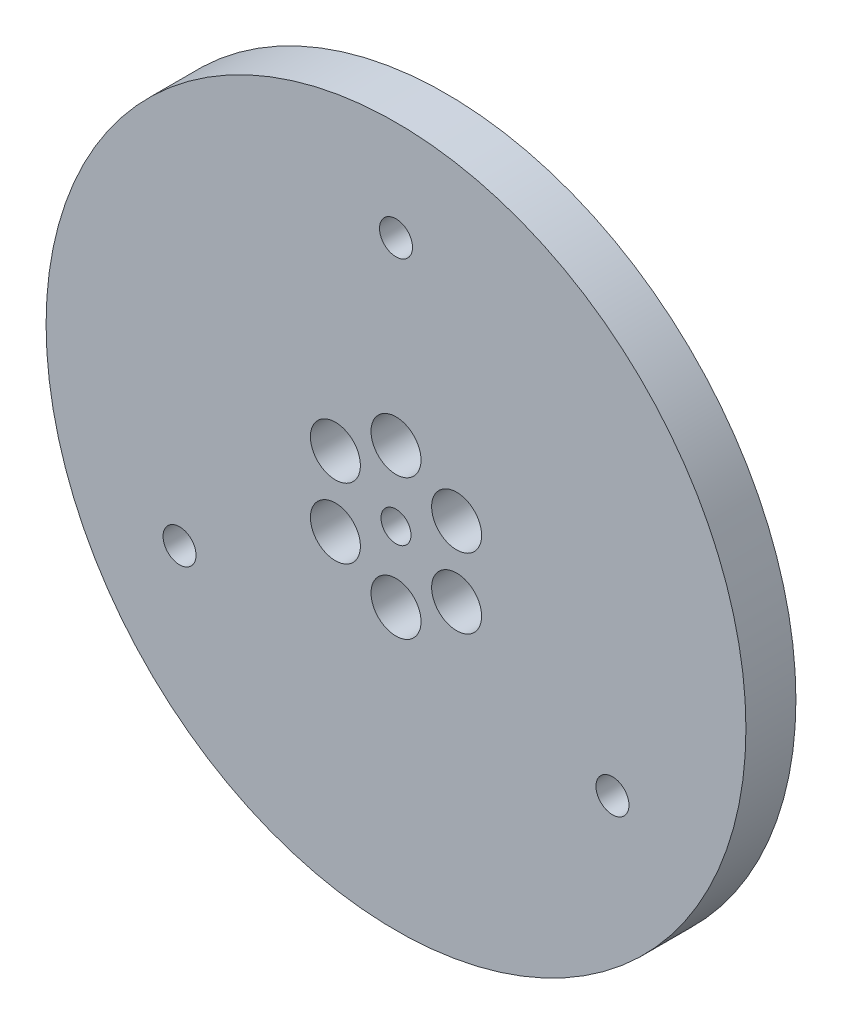
ISO-10303-21;
HEADER;
FILE_DESCRIPTION(('STEP AP214'),'2;1');
FILE_NAME('part.step','',(''),(''),'','','');
FILE_SCHEMA(('AUTOMOTIVE_DESIGN { 1 0 10303 214 1 1 1 1 }'));
ENDSEC;
DATA;
#1=APPLICATION_CONTEXT('core data for automotive mechanical design processes');
#2=APPLICATION_PROTOCOL_DEFINITION('international standard','automotive_design',2000,#1);
#3=PRODUCT_CONTEXT('',#1,'mechanical');
#4=PRODUCT('Part','Part','',(#3));
#5=PRODUCT_RELATED_PRODUCT_CATEGORY('part','',(#4));
#6=PRODUCT_DEFINITION_FORMATION('','',#4);
#7=PRODUCT_DEFINITION_CONTEXT('part definition',#1,'design');
#8=PRODUCT_DEFINITION('design','',#6,#7);
#9=PRODUCT_DEFINITION_SHAPE('','',#8);
#10=(LENGTH_UNIT() NAMED_UNIT(*) SI_UNIT(.MILLI.,.METRE.));
#11=(NAMED_UNIT(*) PLANE_ANGLE_UNIT() SI_UNIT($,.RADIAN.));
#12=(NAMED_UNIT(*) SI_UNIT($,.STERADIAN.) SOLID_ANGLE_UNIT());
#13=UNCERTAINTY_MEASURE_WITH_UNIT(LENGTH_MEASURE(1.E-05),#10,'distance_accuracy_value','');
#14=(GEOMETRIC_REPRESENTATION_CONTEXT(3) GLOBAL_UNCERTAINTY_ASSIGNED_CONTEXT((#13)) GLOBAL_UNIT_ASSIGNED_CONTEXT((#10,
#11,#12)) REPRESENTATION_CONTEXT('',''));
#15=CARTESIAN_POINT('',(0.,0.,0.));
#16=DIRECTION('',(0.,0.,1.));
#17=DIRECTION('',(1.,0.,0.));
#18=AXIS2_PLACEMENT_3D('',#15,#16,#17);
#19=CARTESIAN_POINT('',(0.,0.,5.));
#20=DIRECTION('',(0.,0.,1.));
#21=DIRECTION('',(1.,0.,0.));
#22=AXIS2_PLACEMENT_3D('',#19,#20,#21);
#23=PLANE('',#22);
#24=CARTESIAN_POINT('',(-6.06217782649107,-3.5,5.));
#25=DIRECTION('',(0.,0.,1.));
#26=DIRECTION('',(1.,0.,0.));
#27=AXIS2_PLACEMENT_3D('',#24,#25,#26);
#28=CIRCLE('',#27,2.5);
#29=CARTESIAN_POINT('',(-3.56217782649107,-3.5,5.));
#30=VERTEX_POINT('',#29);
#31=EDGE_CURVE('E104',#30,#30,#28,.T.);
#32=ORIENTED_EDGE('',*,*,#31,.F.);
#33=EDGE_LOOP('',(#32));
#34=FACE_BOUND('',#33,.T.);
#35=CARTESIAN_POINT('',(6.06217782649107,-3.5,5.));
#36=DIRECTION('',(0.,0.,1.));
#37=DIRECTION('',(1.,0.,0.));
#38=AXIS2_PLACEMENT_3D('',#35,#36,#37);
#39=CIRCLE('',#38,2.5);
#40=CARTESIAN_POINT('',(8.56217782649107,-3.5,5.));
#41=VERTEX_POINT('',#40);
#42=EDGE_CURVE('E108',#41,#41,#39,.T.);
#43=ORIENTED_EDGE('',*,*,#42,.F.);
#44=EDGE_LOOP('',(#43));
#45=FACE_BOUND('',#44,.T.);
#46=CARTESIAN_POINT('',(0.,7.,5.));
#47=DIRECTION('',(0.,0.,1.));
#48=DIRECTION('',(1.,0.,0.));
#49=AXIS2_PLACEMENT_3D('',#46,#47,#48);
#50=CIRCLE('',#49,2.5);
#51=CARTESIAN_POINT('',(2.5,7.,5.));
#52=VERTEX_POINT('',#51);
#53=EDGE_CURVE('E112',#52,#52,#50,.T.);
#54=ORIENTED_EDGE('',*,*,#53,.F.);
#55=EDGE_LOOP('',(#54));
#56=FACE_BOUND('',#55,.T.);
#57=CARTESIAN_POINT('',(21.650635094611,-12.5,5.));
#58=DIRECTION('',(0.,0.,1.));
#59=DIRECTION('',(1.,0.,0.));
#60=AXIS2_PLACEMENT_3D('',#57,#58,#59);
#61=CIRCLE('',#60,1.65000000000014);
#62=CARTESIAN_POINT('',(23.3006350946111,-12.5,5.));
#63=VERTEX_POINT('',#62);
#64=EDGE_CURVE('E70',#63,#63,#61,.T.);
#65=ORIENTED_EDGE('',*,*,#64,.F.);
#66=EDGE_LOOP('',(#65));
#67=FACE_BOUND('',#66,.T.);
#68=CARTESIAN_POINT('',(0.,0.,5.));
#69=DIRECTION('',(0.,0.,1.));
#70=DIRECTION('',(1.,0.,0.));
#71=AXIS2_PLACEMENT_3D('',#68,#69,#70);
#72=CIRCLE('',#71,1.5);
#73=CARTESIAN_POINT('',(1.5,0.,5.));
#74=VERTEX_POINT('',#73);
#75=EDGE_CURVE('E48',#74,#74,#72,.T.);
#76=ORIENTED_EDGE('',*,*,#75,.F.);
#77=EDGE_LOOP('',(#76));
#78=FACE_BOUND('',#77,.T.);
#79=CARTESIAN_POINT('',(0.,0.,5.));
#80=DIRECTION('',(0.,0.,1.));
#81=DIRECTION('',(1.,0.,0.));
#82=AXIS2_PLACEMENT_3D('',#79,#80,#81);
#83=CIRCLE('',#82,35.);
#84=CARTESIAN_POINT('',(35.,0.,5.));
#85=VERTEX_POINT('',#84);
#86=EDGE_CURVE('E11',#85,#85,#83,.T.);
#87=ORIENTED_EDGE('',*,*,#86,.T.);
#88=EDGE_LOOP('',(#87));
#89=FACE_BOUND('',#88,.T.);
#90=CARTESIAN_POINT('',(0.,25.,5.));
#91=DIRECTION('',(0.,0.,1.));
#92=DIRECTION('',(1.,0.,0.));
#93=AXIS2_PLACEMENT_3D('',#90,#91,#92);
#94=CIRCLE('',#93,1.65);
#95=CARTESIAN_POINT('',(1.65,25.,5.));
#96=VERTEX_POINT('',#95);
#97=EDGE_CURVE('E61',#96,#96,#94,.T.);
#98=ORIENTED_EDGE('',*,*,#97,.F.);
#99=EDGE_LOOP('',(#98));
#100=FACE_BOUND('',#99,.T.);
#101=CARTESIAN_POINT('',(-21.650635094611,-12.5,5.));
#102=DIRECTION('',(0.,0.,1.));
#103=DIRECTION('',(1.,0.,0.));
#104=AXIS2_PLACEMENT_3D('',#101,#102,#103);
#105=CIRCLE('',#104,1.65);
#106=CARTESIAN_POINT('',(-20.000635094611,-12.5,5.));
#107=VERTEX_POINT('',#106);
#108=EDGE_CURVE('E122',#107,#107,#105,.T.);
#109=ORIENTED_EDGE('',*,*,#108,.F.);
#110=EDGE_LOOP('',(#109));
#111=FACE_BOUND('',#110,.T.);
#112=CARTESIAN_POINT('',(6.06217782649107,3.5,5.));
#113=DIRECTION('',(0.,0.,1.));
#114=DIRECTION('',(1.,0.,0.));
#115=AXIS2_PLACEMENT_3D('',#112,#113,#114);
#116=CIRCLE('',#115,2.5);
#117=CARTESIAN_POINT('',(8.56217782649107,3.5,5.));
#118=VERTEX_POINT('',#117);
#119=EDGE_CURVE('E126',#118,#118,#116,.T.);
#120=ORIENTED_EDGE('',*,*,#119,.F.);
#121=EDGE_LOOP('',(#120));
#122=FACE_BOUND('',#121,.T.);
#123=CARTESIAN_POINT('',(0.,-7.,5.));
#124=DIRECTION('',(0.,0.,1.));
#125=DIRECTION('',(1.,0.,0.));
#126=AXIS2_PLACEMENT_3D('',#123,#124,#125);
#127=CIRCLE('',#126,2.5);
#128=CARTESIAN_POINT('',(2.5,-7.,5.));
#129=VERTEX_POINT('',#128);
#130=EDGE_CURVE('E130',#129,#129,#127,.T.);
#131=ORIENTED_EDGE('',*,*,#130,.F.);
#132=EDGE_LOOP('',(#131));
#133=FACE_BOUND('',#132,.T.);
#134=CARTESIAN_POINT('',(-6.06217782649107,3.49999999999999,5.));
#135=DIRECTION('',(0.,0.,1.));
#136=DIRECTION('',(1.,0.,0.));
#137=AXIS2_PLACEMENT_3D('',#134,#135,#136);
#138=CIRCLE('',#137,2.5);
#139=CARTESIAN_POINT('',(-3.56217782649107,3.49999999999999,5.));
#140=VERTEX_POINT('',#139);
#141=EDGE_CURVE('E133',#140,#140,#138,.T.);
#142=ORIENTED_EDGE('',*,*,#141,.F.);
#143=EDGE_LOOP('',(#142));
#144=FACE_BOUND('',#143,.T.);
#145=ADVANCED_FACE('F34',(#34,#45,#56,#67,#78,#89,#100,#111,#122,#133,#144),#23,.T.);
#146=CARTESIAN_POINT('',(0.,0.,0.));
#147=DIRECTION('',(0.,0.,1.));
#148=DIRECTION('',(1.,0.,0.));
#149=AXIS2_PLACEMENT_3D('',#146,#147,#148);
#150=PLANE('',#149);
#151=CARTESIAN_POINT('',(0.,0.,0.));
#152=DIRECTION('',(0.,0.,1.));
#153=DIRECTION('',(1.,0.,0.));
#154=AXIS2_PLACEMENT_3D('',#151,#152,#153);
#155=CIRCLE('',#154,35.);
#156=CARTESIAN_POINT('',(35.,0.,0.));
#157=VERTEX_POINT('',#156);
#158=EDGE_CURVE('E38',#157,#157,#155,.T.);
#159=ORIENTED_EDGE('',*,*,#158,.F.);
#160=EDGE_LOOP('',(#159));
#161=FACE_BOUND('',#160,.T.);
#162=CARTESIAN_POINT('',(0.,0.,0.));
#163=DIRECTION('',(0.,0.,1.));
#164=DIRECTION('',(1.,0.,0.));
#165=AXIS2_PLACEMENT_3D('',#162,#163,#164);
#166=CIRCLE('',#165,1.5);
#167=CARTESIAN_POINT('',(1.5,0.,0.));
#168=VERTEX_POINT('',#167);
#169=EDGE_CURVE('E51',#168,#168,#166,.T.);
#170=ORIENTED_EDGE('',*,*,#169,.T.);
#171=EDGE_LOOP('',(#170));
#172=FACE_BOUND('',#171,.T.);
#173=CARTESIAN_POINT('',(0.,25.,0.));
#174=DIRECTION('',(0.,0.,1.));
#175=DIRECTION('',(1.,0.,0.));
#176=AXIS2_PLACEMENT_3D('',#173,#174,#175);
#177=CIRCLE('',#176,1.65);
#178=CARTESIAN_POINT('',(1.65,25.,0.));
#179=VERTEX_POINT('',#178);
#180=EDGE_CURVE('E66',#179,#179,#177,.T.);
#181=ORIENTED_EDGE('',*,*,#180,.T.);
#182=EDGE_LOOP('',(#181));
#183=FACE_BOUND('',#182,.T.);
#184=CARTESIAN_POINT('',(21.650635094611,-12.5,0.));
#185=DIRECTION('',(0.,0.,1.));
#186=DIRECTION('',(1.,0.,0.));
#187=AXIS2_PLACEMENT_3D('',#184,#185,#186);
#188=CIRCLE('',#187,1.65000000000014);
#189=CARTESIAN_POINT('',(23.3006350946111,-12.5,0.));
#190=VERTEX_POINT('',#189);
#191=EDGE_CURVE('E67',#190,#190,#188,.T.);
#192=ORIENTED_EDGE('',*,*,#191,.T.);
#193=EDGE_LOOP('',(#192));
#194=FACE_BOUND('',#193,.T.);
#195=CARTESIAN_POINT('',(-21.650635094611,-12.5,0.));
#196=DIRECTION('',(0.,0.,1.));
#197=DIRECTION('',(1.,0.,0.));
#198=AXIS2_PLACEMENT_3D('',#195,#196,#197);
#199=CIRCLE('',#198,1.65);
#200=CARTESIAN_POINT('',(-20.000635094611,-12.5,0.));
#201=VERTEX_POINT('',#200);
#202=EDGE_CURVE('E210',#201,#201,#199,.T.);
#203=ORIENTED_EDGE('',*,*,#202,.T.);
#204=EDGE_LOOP('',(#203));
#205=FACE_BOUND('',#204,.T.);
#206=CARTESIAN_POINT('',(0.,7.,0.));
#207=DIRECTION('',(0.,0.,1.));
#208=DIRECTION('',(1.,0.,0.));
#209=AXIS2_PLACEMENT_3D('',#206,#207,#208);
#210=CIRCLE('',#209,2.5);
#211=CARTESIAN_POINT('',(2.5,7.,0.));
#212=VERTEX_POINT('',#211);
#213=EDGE_CURVE('E165',#212,#212,#210,.T.);
#214=ORIENTED_EDGE('',*,*,#213,.T.);
#215=EDGE_LOOP('',(#214));
#216=FACE_BOUND('',#215,.T.);
#217=CARTESIAN_POINT('',(6.06217782649107,3.5,0.));
#218=DIRECTION('',(0.,0.,1.));
#219=DIRECTION('',(1.,0.,0.));
#220=AXIS2_PLACEMENT_3D('',#217,#218,#219);
#221=CIRCLE('',#220,2.5);
#222=CARTESIAN_POINT('',(8.56217782649107,3.5,0.));
#223=VERTEX_POINT('',#222);
#224=EDGE_CURVE('E158',#223,#223,#221,.T.);
#225=ORIENTED_EDGE('',*,*,#224,.T.);
#226=EDGE_LOOP('',(#225));
#227=FACE_BOUND('',#226,.T.);
#228=CARTESIAN_POINT('',(6.06217782649107,-3.5,0.));
#229=DIRECTION('',(0.,0.,1.));
#230=DIRECTION('',(1.,0.,0.));
#231=AXIS2_PLACEMENT_3D('',#228,#229,#230);
#232=CIRCLE('',#231,2.5);
#233=CARTESIAN_POINT('',(8.56217782649107,-3.5,0.));
#234=VERTEX_POINT('',#233);
#235=EDGE_CURVE('E159',#234,#234,#232,.T.);
#236=ORIENTED_EDGE('',*,*,#235,.T.);
#237=EDGE_LOOP('',(#236));
#238=FACE_BOUND('',#237,.T.);
#239=CARTESIAN_POINT('',(0.,-7.,0.));
#240=DIRECTION('',(0.,0.,1.));
#241=DIRECTION('',(1.,0.,0.));
#242=AXIS2_PLACEMENT_3D('',#239,#240,#241);
#243=CIRCLE('',#242,2.5);
#244=CARTESIAN_POINT('',(2.5,-7.,0.));
#245=VERTEX_POINT('',#244);
#246=EDGE_CURVE('E147',#245,#245,#243,.T.);
#247=ORIENTED_EDGE('',*,*,#246,.T.);
#248=EDGE_LOOP('',(#247));
#249=FACE_BOUND('',#248,.T.);
#250=CARTESIAN_POINT('',(-6.06217782649107,-3.5,0.));
#251=DIRECTION('',(0.,0.,1.));
#252=DIRECTION('',(1.,0.,0.));
#253=AXIS2_PLACEMENT_3D('',#250,#251,#252);
#254=CIRCLE('',#253,2.5);
#255=CARTESIAN_POINT('',(-3.56217782649107,-3.5,0.));
#256=VERTEX_POINT('',#255);
#257=EDGE_CURVE('E136',#256,#256,#254,.T.);
#258=ORIENTED_EDGE('',*,*,#257,.T.);
#259=EDGE_LOOP('',(#258));
#260=FACE_BOUND('',#259,.T.);
#261=CARTESIAN_POINT('',(-6.06217782649107,3.49999999999999,0.));
#262=DIRECTION('',(0.,0.,1.));
#263=DIRECTION('',(1.,0.,0.));
#264=AXIS2_PLACEMENT_3D('',#261,#262,#263);
#265=CIRCLE('',#264,2.5);
#266=CARTESIAN_POINT('',(-3.56217782649107,3.49999999999999,0.));
#267=VERTEX_POINT('',#266);
#268=EDGE_CURVE('E137',#267,#267,#265,.T.);
#269=ORIENTED_EDGE('',*,*,#268,.T.);
#270=EDGE_LOOP('',(#269));
#271=FACE_BOUND('',#270,.T.);
#272=ADVANCED_FACE('F79',(#161,#172,#183,#194,#205,#216,#227,#238,#249,#260,#271),#150,.F.);
#273=CARTESIAN_POINT('',(0.,0.,5.));
#274=DIRECTION('',(0.,0.,-1.));
#275=DIRECTION('',(-1.,0.,0.));
#276=AXIS2_PLACEMENT_3D('',#273,#274,#275);
#277=CYLINDRICAL_SURFACE('',#276,35.);
#278=ORIENTED_EDGE('',*,*,#86,.F.);
#279=EDGE_LOOP('',(#278));
#280=FACE_BOUND('',#279,.T.);
#281=ORIENTED_EDGE('',*,*,#158,.T.);
#282=EDGE_LOOP('',(#281));
#283=FACE_BOUND('',#282,.T.);
#284=ADVANCED_FACE('F36',(#280,#283),#277,.T.);
#285=CARTESIAN_POINT('',(0.,0.,5.));
#286=DIRECTION('',(0.,0.,-1.));
#287=DIRECTION('',(-1.,0.,0.));
#288=AXIS2_PLACEMENT_3D('',#285,#286,#287);
#289=CYLINDRICAL_SURFACE('',#288,1.5);
#290=ORIENTED_EDGE('',*,*,#75,.T.);
#291=EDGE_LOOP('',(#290));
#292=FACE_BOUND('',#291,.T.);
#293=ORIENTED_EDGE('',*,*,#169,.F.);
#294=EDGE_LOOP('',(#293));
#295=FACE_BOUND('',#294,.T.);
#296=ADVANCED_FACE('F82',(#292,#295),#289,.F.);
#297=CARTESIAN_POINT('',(0.,25.,5.));
#298=DIRECTION('',(0.,0.,-1.));
#299=DIRECTION('',(-1.,0.,0.));
#300=AXIS2_PLACEMENT_3D('',#297,#298,#299);
#301=CYLINDRICAL_SURFACE('',#300,1.65);
#302=ORIENTED_EDGE('',*,*,#97,.T.);
#303=EDGE_LOOP('',(#302));
#304=FACE_BOUND('',#303,.T.);
#305=ORIENTED_EDGE('',*,*,#180,.F.);
#306=EDGE_LOOP('',(#305));
#307=FACE_BOUND('',#306,.T.);
#308=ADVANCED_FACE('F84',(#304,#307),#301,.F.);
#309=CARTESIAN_POINT('',(21.650635094611,-12.5,5.));
#310=DIRECTION('',(0.,0.,-1.));
#311=DIRECTION('',(-1.,0.,0.));
#312=AXIS2_PLACEMENT_3D('',#309,#310,#311);
#313=CYLINDRICAL_SURFACE('',#312,1.65000000000014);
#314=ORIENTED_EDGE('',*,*,#64,.T.);
#315=EDGE_LOOP('',(#314));
#316=FACE_BOUND('',#315,.T.);
#317=ORIENTED_EDGE('',*,*,#191,.F.);
#318=EDGE_LOOP('',(#317));
#319=FACE_BOUND('',#318,.T.);
#320=ADVANCED_FACE('F90',(#316,#319),#313,.F.);
#321=CARTESIAN_POINT('',(-21.650635094611,-12.5,5.));
#322=DIRECTION('',(0.,0.,-1.));
#323=DIRECTION('',(-1.,0.,0.));
#324=AXIS2_PLACEMENT_3D('',#321,#322,#323);
#325=CYLINDRICAL_SURFACE('',#324,1.65);
#326=ORIENTED_EDGE('',*,*,#108,.T.);
#327=EDGE_LOOP('',(#326));
#328=FACE_BOUND('',#327,.T.);
#329=ORIENTED_EDGE('',*,*,#202,.F.);
#330=EDGE_LOOP('',(#329));
#331=FACE_BOUND('',#330,.T.);
#332=ADVANCED_FACE('F196',(#328,#331),#325,.F.);
#333=CARTESIAN_POINT('',(0.,7.,5.));
#334=DIRECTION('',(0.,0.,-1.));
#335=DIRECTION('',(-1.,0.,0.));
#336=AXIS2_PLACEMENT_3D('',#333,#334,#335);
#337=CYLINDRICAL_SURFACE('',#336,2.5);
#338=ORIENTED_EDGE('',*,*,#53,.T.);
#339=EDGE_LOOP('',(#338));
#340=FACE_BOUND('',#339,.T.);
#341=ORIENTED_EDGE('',*,*,#213,.F.);
#342=EDGE_LOOP('',(#341));
#343=FACE_BOUND('',#342,.T.);
#344=ADVANCED_FACE('F192',(#340,#343),#337,.F.);
#345=CARTESIAN_POINT('',(6.06217782649107,3.5,5.));
#346=DIRECTION('',(0.,0.,-1.));
#347=DIRECTION('',(-1.,0.,0.));
#348=AXIS2_PLACEMENT_3D('',#345,#346,#347);
#349=CYLINDRICAL_SURFACE('',#348,2.5);
#350=ORIENTED_EDGE('',*,*,#119,.T.);
#351=EDGE_LOOP('',(#350));
#352=FACE_BOUND('',#351,.T.);
#353=ORIENTED_EDGE('',*,*,#224,.F.);
#354=EDGE_LOOP('',(#353));
#355=FACE_BOUND('',#354,.T.);
#356=ADVANCED_FACE('F185',(#352,#355),#349,.F.);
#357=CARTESIAN_POINT('',(6.06217782649107,-3.5,5.));
#358=DIRECTION('',(0.,0.,-1.));
#359=DIRECTION('',(-1.,0.,0.));
#360=AXIS2_PLACEMENT_3D('',#357,#358,#359);
#361=CYLINDRICAL_SURFACE('',#360,2.5);
#362=ORIENTED_EDGE('',*,*,#42,.T.);
#363=EDGE_LOOP('',(#362));
#364=FACE_BOUND('',#363,.T.);
#365=ORIENTED_EDGE('',*,*,#235,.F.);
#366=EDGE_LOOP('',(#365));
#367=FACE_BOUND('',#366,.T.);
#368=ADVANCED_FACE('F176',(#364,#367),#361,.F.);
#369=CARTESIAN_POINT('',(0.,-7.,5.));
#370=DIRECTION('',(0.,0.,-1.));
#371=DIRECTION('',(-1.,0.,0.));
#372=AXIS2_PLACEMENT_3D('',#369,#370,#371);
#373=CYLINDRICAL_SURFACE('',#372,2.5);
#374=ORIENTED_EDGE('',*,*,#130,.T.);
#375=EDGE_LOOP('',(#374));
#376=FACE_BOUND('',#375,.T.);
#377=ORIENTED_EDGE('',*,*,#246,.F.);
#378=EDGE_LOOP('',(#377));
#379=FACE_BOUND('',#378,.T.);
#380=ADVANCED_FACE('F173',(#376,#379),#373,.F.);
#381=CARTESIAN_POINT('',(-6.06217782649107,-3.5,5.));
#382=DIRECTION('',(0.,0.,-1.));
#383=DIRECTION('',(-1.,0.,0.));
#384=AXIS2_PLACEMENT_3D('',#381,#382,#383);
#385=CYLINDRICAL_SURFACE('',#384,2.5);
#386=ORIENTED_EDGE('',*,*,#31,.T.);
#387=EDGE_LOOP('',(#386));
#388=FACE_BOUND('',#387,.T.);
#389=ORIENTED_EDGE('',*,*,#257,.F.);
#390=EDGE_LOOP('',(#389));
#391=FACE_BOUND('',#390,.T.);
#392=ADVANCED_FACE('F175',(#388,#391),#385,.F.);
#393=CARTESIAN_POINT('',(-6.06217782649107,3.49999999999999,5.));
#394=DIRECTION('',(0.,0.,-1.));
#395=DIRECTION('',(-1.,0.,0.));
#396=AXIS2_PLACEMENT_3D('',#393,#394,#395);
#397=CYLINDRICAL_SURFACE('',#396,2.5);
#398=ORIENTED_EDGE('',*,*,#141,.T.);
#399=EDGE_LOOP('',(#398));
#400=FACE_BOUND('',#399,.T.);
#401=ORIENTED_EDGE('',*,*,#268,.F.);
#402=EDGE_LOOP('',(#401));
#403=FACE_BOUND('',#402,.T.);
#404=ADVANCED_FACE('F182',(#400,#403),#397,.F.);
#405=CLOSED_SHELL('',(#145,#272,#284,#296,#308,#320,#332,#344,#356,#368,#380,#392,#404));
#406=MANIFOLD_SOLID_BREP('B2',#405);
#407=ADVANCED_BREP_SHAPE_REPRESENTATION('',(#18,#406),#14);
#408=SHAPE_DEFINITION_REPRESENTATION(#9,#407);
ENDSEC;
END-ISO-10303-21;
